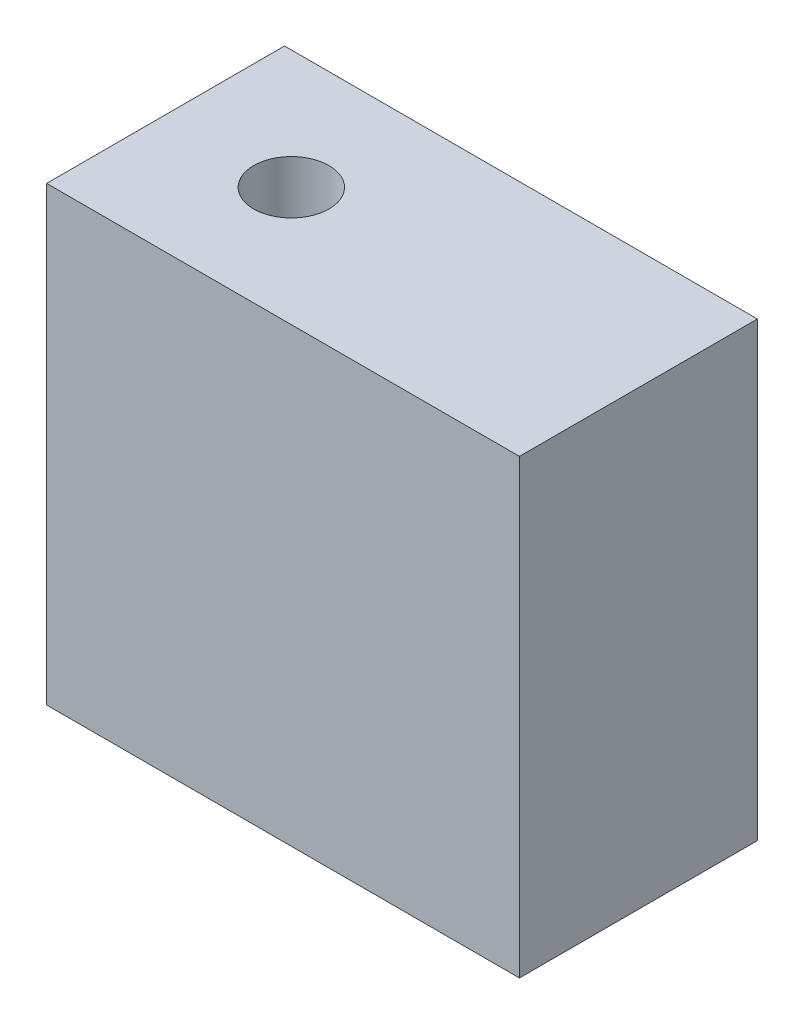
ISO-10303-21;
HEADER;
FILE_DESCRIPTION(('STEP AP214'),'2;1');
FILE_NAME('part.step','',(''),(''),'','','');
FILE_SCHEMA(('AUTOMOTIVE_DESIGN { 1 0 10303 214 1 1 1 1 }'));
ENDSEC;
DATA;
#1=APPLICATION_CONTEXT('core data for automotive mechanical design processes');
#2=APPLICATION_PROTOCOL_DEFINITION('international standard','automotive_design',2000,#1);
#3=PRODUCT_CONTEXT('',#1,'mechanical');
#4=PRODUCT('Part','Part','',(#3));
#5=PRODUCT_RELATED_PRODUCT_CATEGORY('part','',(#4));
#6=PRODUCT_DEFINITION_FORMATION('','',#4);
#7=PRODUCT_DEFINITION_CONTEXT('part definition',#1,'design');
#8=PRODUCT_DEFINITION('design','',#6,#7);
#9=PRODUCT_DEFINITION_SHAPE('','',#8);
#10=(LENGTH_UNIT() NAMED_UNIT(*) SI_UNIT(.MILLI.,.METRE.));
#11=(NAMED_UNIT(*) PLANE_ANGLE_UNIT() SI_UNIT($,.RADIAN.));
#12=(NAMED_UNIT(*) SI_UNIT($,.STERADIAN.) SOLID_ANGLE_UNIT());
#13=UNCERTAINTY_MEASURE_WITH_UNIT(LENGTH_MEASURE(1.E-05),#10,'distance_accuracy_value','');
#14=(GEOMETRIC_REPRESENTATION_CONTEXT(3) GLOBAL_UNCERTAINTY_ASSIGNED_CONTEXT((#13)) GLOBAL_UNIT_ASSIGNED_CONTEXT((#10,
#11,#12)) REPRESENTATION_CONTEXT('',''));
#15=CARTESIAN_POINT('',(0.,0.,0.));
#16=DIRECTION('',(0.,0.,1.));
#17=DIRECTION('',(1.,0.,0.));
#18=AXIS2_PLACEMENT_3D('',#15,#16,#17);
#19=CARTESIAN_POINT('',(0.,38.1,0.));
#20=DIRECTION('',(-1.,0.,0.));
#21=DIRECTION('',(0.,0.,1.));
#22=AXIS2_PLACEMENT_3D('',#19,#20,#21);
#23=PLANE('',#22);
#24=DIRECTION('',(0.,0.,-1.));
#25=VECTOR('',#24,1.);
#26=CARTESIAN_POINT('',(0.,0.,0.));
#27=LINE('',#26,#25);
#28=CARTESIAN_POINT('',(0.,0.,20.066));
#29=VERTEX_POINT('',#28);
#30=CARTESIAN_POINT('',(0.,0.,0.));
#31=VERTEX_POINT('',#30);
#32=EDGE_CURVE('E96',#29,#31,#27,.T.);
#33=ORIENTED_EDGE('',*,*,#32,.T.);
#34=DIRECTION('',(0.,-1.,0.));
#35=VECTOR('',#34,1.);
#36=CARTESIAN_POINT('',(0.,38.1,0.));
#37=LINE('',#36,#35);
#38=CARTESIAN_POINT('',(0.,38.1,0.));
#39=VERTEX_POINT('',#38);
#40=EDGE_CURVE('E11',#39,#31,#37,.T.);
#41=ORIENTED_EDGE('',*,*,#40,.F.);
#42=DIRECTION('',(0.,0.,-1.));
#43=VECTOR('',#42,1.);
#44=CARTESIAN_POINT('',(0.,38.1,0.));
#45=LINE('',#44,#43);
#46=CARTESIAN_POINT('',(0.,38.1,20.066));
#47=VERTEX_POINT('',#46);
#48=EDGE_CURVE('E84',#47,#39,#45,.T.);
#49=ORIENTED_EDGE('',*,*,#48,.F.);
#50=DIRECTION('',(0.,-1.,0.));
#51=VECTOR('',#50,1.);
#52=CARTESIAN_POINT('',(0.,38.1,20.066));
#53=LINE('',#52,#51);
#54=EDGE_CURVE('E92',#47,#29,#53,.T.);
#55=ORIENTED_EDGE('',*,*,#54,.T.);
#56=EDGE_LOOP('',(#33,#41,#49,#55));
#57=FACE_BOUND('',#56,.T.);
#58=ADVANCED_FACE('F33',(#57),#23,.F.);
#59=CARTESIAN_POINT('',(0.,38.1,0.));
#60=DIRECTION('',(0.,0.,1.));
#61=DIRECTION('',(1.,0.,0.));
#62=AXIS2_PLACEMENT_3D('',#59,#60,#61);
#63=PLANE('',#62);
#64=DIRECTION('',(-1.,0.,0.));
#65=VECTOR('',#64,1.);
#66=CARTESIAN_POINT('',(0.,0.,0.));
#67=LINE('',#66,#65);
#68=CARTESIAN_POINT('',(-39.878,0.,0.));
#69=VERTEX_POINT('',#68);
#70=EDGE_CURVE('E88',#31,#69,#67,.T.);
#71=ORIENTED_EDGE('',*,*,#70,.T.);
#72=DIRECTION('',(0.,-1.,0.));
#73=VECTOR('',#72,1.);
#74=CARTESIAN_POINT('',(-39.878,38.1,0.));
#75=LINE('',#74,#73);
#76=CARTESIAN_POINT('',(-39.878,38.1,0.));
#77=VERTEX_POINT('',#76);
#78=EDGE_CURVE('E41',#77,#69,#75,.T.);
#79=ORIENTED_EDGE('',*,*,#78,.F.);
#80=DIRECTION('',(-1.,0.,0.));
#81=VECTOR('',#80,1.);
#82=CARTESIAN_POINT('',(0.,38.1,0.));
#83=LINE('',#82,#81);
#84=EDGE_CURVE('E79',#39,#77,#83,.T.);
#85=ORIENTED_EDGE('',*,*,#84,.F.);
#86=ORIENTED_EDGE('',*,*,#40,.T.);
#87=EDGE_LOOP('',(#71,#79,#85,#86));
#88=FACE_BOUND('',#87,.T.);
#89=ADVANCED_FACE('F87',(#88),#63,.F.);
#90=CARTESIAN_POINT('',(-39.878,38.1,0.));
#91=DIRECTION('',(1.,0.,0.));
#92=DIRECTION('',(0.,0.,-1.));
#93=AXIS2_PLACEMENT_3D('',#90,#91,#92);
#94=PLANE('',#93);
#95=DIRECTION('',(0.,0.,1.));
#96=VECTOR('',#95,1.);
#97=CARTESIAN_POINT('',(-39.878,0.,0.));
#98=LINE('',#97,#96);
#99=CARTESIAN_POINT('',(-39.878,0.,20.066));
#100=VERTEX_POINT('',#99);
#101=EDGE_CURVE('E66',#69,#100,#98,.T.);
#102=ORIENTED_EDGE('',*,*,#101,.T.);
#103=DIRECTION('',(0.,-1.,0.));
#104=VECTOR('',#103,1.);
#105=CARTESIAN_POINT('',(-39.878,38.1,20.066));
#106=LINE('',#105,#104);
#107=CARTESIAN_POINT('',(-39.878,38.1,20.066));
#108=VERTEX_POINT('',#107);
#109=EDGE_CURVE('E89',#108,#100,#106,.T.);
#110=ORIENTED_EDGE('',*,*,#109,.F.);
#111=DIRECTION('',(0.,0.,1.));
#112=VECTOR('',#111,1.);
#113=CARTESIAN_POINT('',(-39.878,38.1,0.));
#114=LINE('',#113,#112);
#115=EDGE_CURVE('E82',#77,#108,#114,.T.);
#116=ORIENTED_EDGE('',*,*,#115,.F.);
#117=ORIENTED_EDGE('',*,*,#78,.T.);
#118=EDGE_LOOP('',(#102,#110,#116,#117));
#119=FACE_BOUND('',#118,.T.);
#120=ADVANCED_FACE('F90',(#119),#94,.F.);
#121=CARTESIAN_POINT('',(0.,38.1,20.066));
#122=DIRECTION('',(0.,0.,-1.));
#123=DIRECTION('',(-1.,0.,0.));
#124=AXIS2_PLACEMENT_3D('',#121,#122,#123);
#125=PLANE('',#124);
#126=DIRECTION('',(1.,0.,0.));
#127=VECTOR('',#126,1.);
#128=CARTESIAN_POINT('',(0.,0.,20.066));
#129=LINE('',#128,#127);
#130=EDGE_CURVE('E72',#100,#29,#129,.T.);
#131=ORIENTED_EDGE('',*,*,#130,.T.);
#132=ORIENTED_EDGE('',*,*,#54,.F.);
#133=DIRECTION('',(1.,0.,0.));
#134=VECTOR('',#133,1.);
#135=CARTESIAN_POINT('',(0.,38.1,20.066));
#136=LINE('',#135,#134);
#137=EDGE_CURVE('E49',#108,#47,#136,.T.);
#138=ORIENTED_EDGE('',*,*,#137,.F.);
#139=ORIENTED_EDGE('',*,*,#109,.T.);
#140=EDGE_LOOP('',(#131,#132,#138,#139));
#141=FACE_BOUND('',#140,.T.);
#142=ADVANCED_FACE('F104',(#141),#125,.F.);
#143=CARTESIAN_POINT('',(0.,38.1,0.));
#144=DIRECTION('',(0.,-1.,0.));
#145=DIRECTION('',(0.,0.,-1.));
#146=AXIS2_PLACEMENT_3D('',#143,#144,#145);
#147=PLANE('',#146);
#148=CARTESIAN_POINT('',(-29.2735,38.1,10.033));
#149=DIRECTION('',(0.,1.,0.));
#150=DIRECTION('',(0.,0.,1.));
#151=AXIS2_PLACEMENT_3D('',#148,#149,#150);
#152=CIRCLE('',#151,3.175);
#153=CARTESIAN_POINT('',(-29.2735,38.1,13.208));
#154=VERTEX_POINT('',#153);
#155=EDGE_CURVE('E110',#154,#154,#152,.T.);
#156=ORIENTED_EDGE('',*,*,#155,.F.);
#157=EDGE_LOOP('',(#156));
#158=FACE_BOUND('',#157,.T.);
#159=ORIENTED_EDGE('',*,*,#48,.T.);
#160=ORIENTED_EDGE('',*,*,#84,.T.);
#161=ORIENTED_EDGE('',*,*,#115,.T.);
#162=ORIENTED_EDGE('',*,*,#137,.T.);
#163=EDGE_LOOP('',(#159,#160,#161,#162));
#164=FACE_BOUND('',#163,.T.);
#165=ADVANCED_FACE('F80',(#158,#164),#147,.F.);
#166=CARTESIAN_POINT('',(0.,0.,0.));
#167=DIRECTION('',(0.,-1.,0.));
#168=DIRECTION('',(0.,0.,-1.));
#169=AXIS2_PLACEMENT_3D('',#166,#167,#168);
#170=PLANE('',#169);
#171=ORIENTED_EDGE('',*,*,#32,.F.);
#172=ORIENTED_EDGE('',*,*,#130,.F.);
#173=ORIENTED_EDGE('',*,*,#101,.F.);
#174=ORIENTED_EDGE('',*,*,#70,.F.);
#175=EDGE_LOOP('',(#171,#172,#173,#174));
#176=FACE_BOUND('',#175,.T.);
#177=ADVANCED_FACE('F107',(#176),#170,.T.);
#178=CARTESIAN_POINT('',(-29.2735,25.4,10.033));
#179=DIRECTION('',(0.,1.,0.));
#180=DIRECTION('',(0.,0.,1.));
#181=AXIS2_PLACEMENT_3D('',#178,#179,#180);
#182=CYLINDRICAL_SURFACE('',#181,3.175);
#183=CARTESIAN_POINT('',(-29.2735,25.4,10.033));
#184=DIRECTION('',(0.,1.,0.));
#185=DIRECTION('',(0.,0.,1.));
#186=AXIS2_PLACEMENT_3D('',#183,#184,#185);
#187=CIRCLE('',#186,3.175);
#188=CARTESIAN_POINT('',(-29.2735,25.4,13.208));
#189=VERTEX_POINT('',#188);
#190=EDGE_CURVE('E99',#189,#189,#187,.T.);
#191=ORIENTED_EDGE('',*,*,#190,.F.);
#192=EDGE_LOOP('',(#191));
#193=FACE_BOUND('',#192,.T.);
#194=ORIENTED_EDGE('',*,*,#155,.T.);
#195=EDGE_LOOP('',(#194));
#196=FACE_BOUND('',#195,.T.);
#197=ADVANCED_FACE('F118',(#193,#196),#182,.F.);
#198=CARTESIAN_POINT('',(-29.2735,25.4,10.033));
#199=DIRECTION('',(0.,1.,0.));
#200=DIRECTION('',(0.,0.,1.));
#201=AXIS2_PLACEMENT_3D('',#198,#199,#200);
#202=PLANE('',#201);
#203=ORIENTED_EDGE('',*,*,#190,.T.);
#204=EDGE_LOOP('',(#203));
#205=FACE_BOUND('',#204,.T.);
#206=ADVANCED_FACE('F116',(#205),#202,.T.);
#207=CLOSED_SHELL('',(#58,#89,#120,#142,#165,#177,#197,#206));
#208=MANIFOLD_SOLID_BREP('B2',#207);
#209=ADVANCED_BREP_SHAPE_REPRESENTATION('',(#18,#208),#14);
#210=SHAPE_DEFINITION_REPRESENTATION(#9,#209);
ENDSEC;
END-ISO-10303-21;
